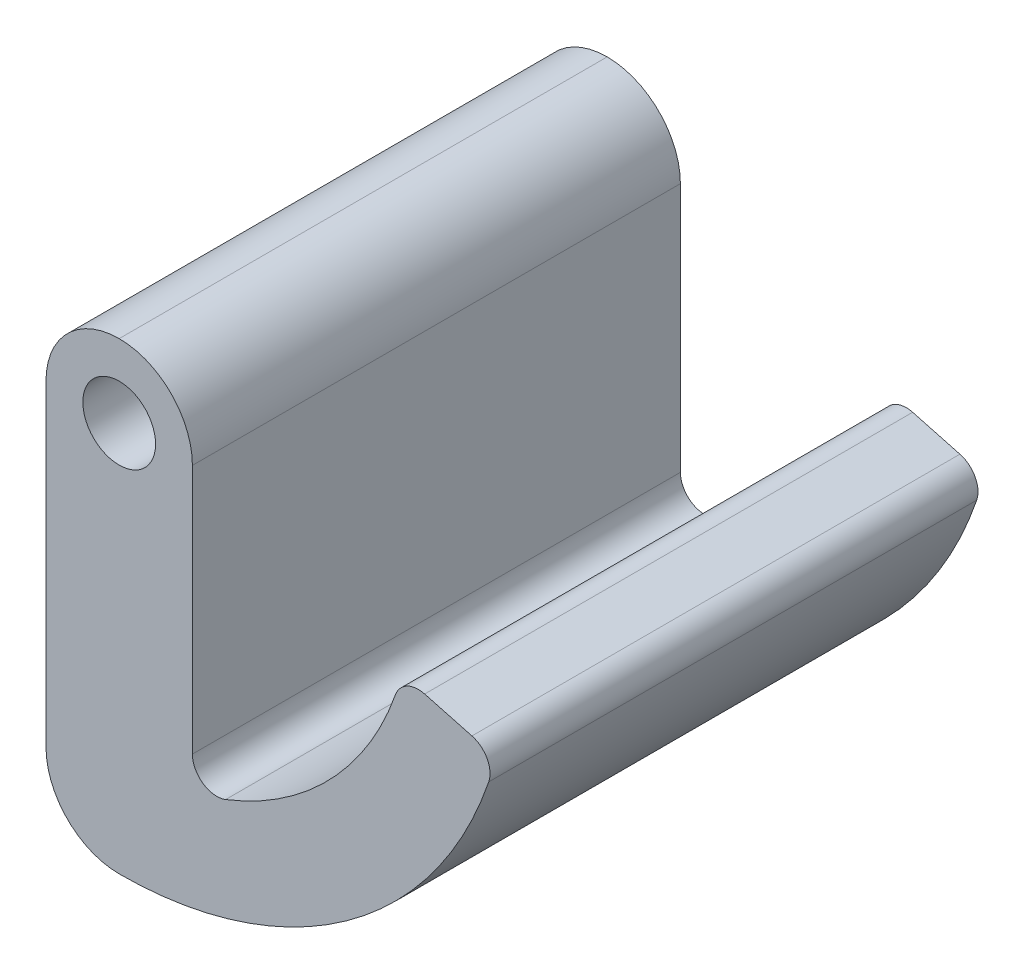
ISO-10303-21;
HEADER;
FILE_DESCRIPTION(('STEP AP214'),'2;1');
FILE_NAME('part.step','',(''),(''),'','','');
FILE_SCHEMA(('AUTOMOTIVE_DESIGN { 1 0 10303 214 1 1 1 1 }'));
ENDSEC;
DATA;
#1=APPLICATION_CONTEXT('core data for automotive mechanical design processes');
#2=APPLICATION_PROTOCOL_DEFINITION('international standard','automotive_design',2000,#1);
#3=PRODUCT_CONTEXT('',#1,'mechanical');
#4=PRODUCT('Part','Part','',(#3));
#5=PRODUCT_RELATED_PRODUCT_CATEGORY('part','',(#4));
#6=PRODUCT_DEFINITION_FORMATION('','',#4);
#7=PRODUCT_DEFINITION_CONTEXT('part definition',#1,'design');
#8=PRODUCT_DEFINITION('design','',#6,#7);
#9=PRODUCT_DEFINITION_SHAPE('','',#8);
#10=(LENGTH_UNIT() NAMED_UNIT(*) SI_UNIT(.MILLI.,.METRE.));
#11=(NAMED_UNIT(*) PLANE_ANGLE_UNIT() SI_UNIT($,.RADIAN.));
#12=(NAMED_UNIT(*) SI_UNIT($,.STERADIAN.) SOLID_ANGLE_UNIT());
#13=UNCERTAINTY_MEASURE_WITH_UNIT(LENGTH_MEASURE(1.E-05),#10,'distance_accuracy_value','');
#14=(GEOMETRIC_REPRESENTATION_CONTEXT(3) GLOBAL_UNCERTAINTY_ASSIGNED_CONTEXT((#13)) GLOBAL_UNIT_ASSIGNED_CONTEXT((#10,
#11,#12)) REPRESENTATION_CONTEXT('',''));
#15=CARTESIAN_POINT('',(0.,0.,0.));
#16=DIRECTION('',(0.,0.,1.));
#17=DIRECTION('',(1.,0.,0.));
#18=AXIS2_PLACEMENT_3D('',#15,#16,#17);
#19=CARTESIAN_POINT('',(0.,0.,20.));
#20=DIRECTION('',(0.,0.,1.));
#21=DIRECTION('',(1.,0.,0.));
#22=AXIS2_PLACEMENT_3D('',#19,#20,#21);
#23=PLANE('',#22);
#24=CARTESIAN_POINT('',(0.,0.,20.));
#25=DIRECTION('',(0.,0.,1.));
#26=DIRECTION('',(1.,0.,0.));
#27=AXIS2_PLACEMENT_3D('',#24,#25,#26);
#28=CIRCLE('',#27,32.);
#29=CARTESIAN_POINT('',(0.,-32.,20.));
#30=VERTEX_POINT('',#29);
#31=CARTESIAN_POINT('',(30.2887145961351,-10.3244258006861,20.));
#32=VERTEX_POINT('',#31);
#33=EDGE_CURVE('E123',#30,#32,#28,.T.);
#34=ORIENTED_EDGE('',*,*,#33,.T.);
#35=CARTESIAN_POINT('',(28.3956699338766,-9.67914918814325,20.));
#36=DIRECTION('',(0.,0.,1.));
#37=DIRECTION('',(1.,0.,0.));
#38=AXIS2_PLACEMENT_3D('',#35,#36,#37);
#39=CIRCLE('',#38,2.);
#40=CARTESIAN_POINT('',(28.9133080240817,-7.74729753556512,20.));
#41=VERTEX_POINT('',#40);
#42=EDGE_CURVE('E186',#32,#41,#39,.T.);
#43=ORIENTED_EDGE('',*,*,#42,.T.);
#44=DIRECTION('',(-0.965925826289067,0.258819045102524,0.));
#45=VECTOR('',#44,1.);
#46=CARTESIAN_POINT('',(23.1822198309376,-6.21165708246059,20.));
#47=LINE('',#46,#45);
#48=CARTESIAN_POINT('',(25.0396592562992,-6.70935647647597,20.));
#49=VERTEX_POINT('',#48);
#50=EDGE_CURVE('E136',#41,#49,#47,.T.);
#51=ORIENTED_EDGE('',*,*,#50,.T.);
#52=CARTESIAN_POINT('',(24.5220211660942,-8.6412081290541,20.));
#53=DIRECTION('',(0.,0.,1.));
#54=DIRECTION('',(1.,0.,0.));
#55=AXIS2_PLACEMENT_3D('',#52,#53,#54);
#56=CIRCLE('',#55,2.);
#57=CARTESIAN_POINT('',(22.6357118456254,-7.97649981143455,20.));
#58=VERTEX_POINT('',#57);
#59=EDGE_CURVE('E184',#49,#58,#56,.T.);
#60=ORIENTED_EDGE('',*,*,#59,.T.);
#61=CARTESIAN_POINT('',(0.,0.,20.));
#62=DIRECTION('',(0.,0.,-1.));
#63=DIRECTION('',(1.,0.,0.));
#64=AXIS2_PLACEMENT_3D('',#61,#62,#63);
#65=CIRCLE('',#64,24.);
#66=CARTESIAN_POINT('',(8.72727272727273,-22.3569834893664,20.));
#67=VERTEX_POINT('',#66);
#68=EDGE_CURVE('E144',#58,#67,#65,.T.);
#69=ORIENTED_EDGE('',*,*,#68,.T.);
#70=CARTESIAN_POINT('',(8.,-20.4939015319192,20.));
#71=DIRECTION('',(0.,0.,1.));
#72=DIRECTION('',(1.,0.,0.));
#73=AXIS2_PLACEMENT_3D('',#70,#71,#72);
#74=CIRCLE('',#73,2.);
#75=CARTESIAN_POINT('',(6.,-20.4939015319192,20.));
#76=VERTEX_POINT('',#75);
#77=EDGE_CURVE('E11',#67,#76,#74,.F.);
#78=ORIENTED_EDGE('',*,*,#77,.T.);
#79=DIRECTION('',(0.,1.,0.));
#80=VECTOR('',#79,1.);
#81=CARTESIAN_POINT('',(6.,6.,20.));
#82=LINE('',#81,#80);
#83=CARTESIAN_POINT('',(6.,0.,20.));
#84=VERTEX_POINT('',#83);
#85=EDGE_CURVE('E140',#76,#84,#82,.T.);
#86=ORIENTED_EDGE('',*,*,#85,.T.);
#87=CARTESIAN_POINT('',(0.,0.,20.));
#88=DIRECTION('',(0.,0.,1.));
#89=DIRECTION('',(1.,0.,0.));
#90=AXIS2_PLACEMENT_3D('',#87,#88,#89);
#91=CIRCLE('',#90,6.);
#92=CARTESIAN_POINT('',(0.,6.,20.));
#93=VERTEX_POINT('',#92);
#94=EDGE_CURVE('E157',#84,#93,#91,.T.);
#95=ORIENTED_EDGE('',*,*,#94,.T.);
#96=CARTESIAN_POINT('',(0.,0.,20.));
#97=DIRECTION('',(0.,0.,1.));
#98=DIRECTION('',(1.,0.,0.));
#99=AXIS2_PLACEMENT_3D('',#96,#97,#98);
#100=CIRCLE('',#99,6.);
#101=CARTESIAN_POINT('',(-6.,0.,20.));
#102=VERTEX_POINT('',#101);
#103=EDGE_CURVE('E130',#93,#102,#100,.T.);
#104=ORIENTED_EDGE('',*,*,#103,.T.);
#105=DIRECTION('',(0.,-1.,0.));
#106=VECTOR('',#105,1.);
#107=CARTESIAN_POINT('',(-6.,6.,20.));
#108=LINE('',#107,#106);
#109=CARTESIAN_POINT('',(-6.,-26.,20.));
#110=VERTEX_POINT('',#109);
#111=EDGE_CURVE('E126',#102,#110,#108,.T.);
#112=ORIENTED_EDGE('',*,*,#111,.T.);
#113=CARTESIAN_POINT('',(0.,-26.,20.));
#114=DIRECTION('',(0.,0.,1.));
#115=DIRECTION('',(1.,0.,0.));
#116=AXIS2_PLACEMENT_3D('',#113,#114,#115);
#117=CIRCLE('',#116,6.);
#118=EDGE_CURVE('E121',#110,#30,#117,.T.);
#119=ORIENTED_EDGE('',*,*,#118,.T.);
#120=EDGE_LOOP('',(#34,#43,#51,#60,#69,#78,#86,#95,#104,#112,#119));
#121=FACE_BOUND('',#120,.T.);
#122=CARTESIAN_POINT('',(0.,0.,20.));
#123=DIRECTION('',(0.,0.,1.));
#124=DIRECTION('',(1.,0.,0.));
#125=AXIS2_PLACEMENT_3D('',#122,#123,#124);
#126=CIRCLE('',#125,2.98);
#127=CARTESIAN_POINT('',(2.98,0.,20.));
#128=VERTEX_POINT('',#127);
#129=EDGE_CURVE('E224',#128,#128,#126,.T.);
#130=ORIENTED_EDGE('',*,*,#129,.F.);
#131=EDGE_LOOP('',(#130));
#132=FACE_BOUND('',#131,.T.);
#133=ADVANCED_FACE('F37',(#121,#132),#23,.T.);
#134=CARTESIAN_POINT('',(0.,0.,-20.));
#135=DIRECTION('',(0.,0.,1.));
#136=DIRECTION('',(1.,0.,0.));
#137=AXIS2_PLACEMENT_3D('',#134,#135,#136);
#138=PLANE('',#137);
#139=DIRECTION('',(-0.965925826289067,0.258819045102524,0.));
#140=VECTOR('',#139,1.);
#141=CARTESIAN_POINT('',(23.1822198309376,-6.21165708246059,-20.));
#142=LINE('',#141,#140);
#143=CARTESIAN_POINT('',(28.9133080240817,-7.74729753556512,-20.));
#144=VERTEX_POINT('',#143);
#145=CARTESIAN_POINT('',(25.0396592562992,-6.70935647647597,-20.));
#146=VERTEX_POINT('',#145);
#147=EDGE_CURVE('E201',#144,#146,#142,.T.);
#148=ORIENTED_EDGE('',*,*,#147,.F.);
#149=CARTESIAN_POINT('',(28.3956699338766,-9.67914918814325,-20.));
#150=DIRECTION('',(0.,0.,1.));
#151=DIRECTION('',(1.,0.,0.));
#152=AXIS2_PLACEMENT_3D('',#149,#150,#151);
#153=CIRCLE('',#152,2.);
#154=CARTESIAN_POINT('',(30.2887145961351,-10.3244258006861,-20.));
#155=VERTEX_POINT('',#154);
#156=EDGE_CURVE('E60',#144,#155,#153,.F.);
#157=ORIENTED_EDGE('',*,*,#156,.T.);
#158=CARTESIAN_POINT('',(0.,0.,-20.));
#159=DIRECTION('',(0.,0.,1.));
#160=DIRECTION('',(1.,0.,0.));
#161=AXIS2_PLACEMENT_3D('',#158,#159,#160);
#162=CIRCLE('',#161,32.);
#163=CARTESIAN_POINT('',(0.,-32.,-20.));
#164=VERTEX_POINT('',#163);
#165=EDGE_CURVE('E223',#164,#155,#162,.T.);
#166=ORIENTED_EDGE('',*,*,#165,.F.);
#167=CARTESIAN_POINT('',(0.,-26.,-20.));
#168=DIRECTION('',(0.,0.,1.));
#169=DIRECTION('',(1.,0.,0.));
#170=AXIS2_PLACEMENT_3D('',#167,#168,#169);
#171=CIRCLE('',#170,6.);
#172=CARTESIAN_POINT('',(-6.,-26.,-20.));
#173=VERTEX_POINT('',#172);
#174=EDGE_CURVE('E139',#164,#173,#171,.F.);
#175=ORIENTED_EDGE('',*,*,#174,.T.);
#176=DIRECTION('',(0.,-1.,0.));
#177=VECTOR('',#176,1.);
#178=CARTESIAN_POINT('',(-6.,6.,-20.));
#179=LINE('',#178,#177);
#180=CARTESIAN_POINT('',(-6.,0.,-20.));
#181=VERTEX_POINT('',#180);
#182=EDGE_CURVE('E222',#181,#173,#179,.T.);
#183=ORIENTED_EDGE('',*,*,#182,.F.);
#184=CARTESIAN_POINT('',(0.,0.,-20.));
#185=DIRECTION('',(0.,0.,1.));
#186=DIRECTION('',(1.,0.,0.));
#187=AXIS2_PLACEMENT_3D('',#184,#185,#186);
#188=CIRCLE('',#187,6.);
#189=CARTESIAN_POINT('',(0.,6.,-20.));
#190=VERTEX_POINT('',#189);
#191=EDGE_CURVE('E142',#181,#190,#188,.F.);
#192=ORIENTED_EDGE('',*,*,#191,.T.);
#193=CARTESIAN_POINT('',(0.,0.,-20.));
#194=DIRECTION('',(0.,0.,1.));
#195=DIRECTION('',(1.,0.,0.));
#196=AXIS2_PLACEMENT_3D('',#193,#194,#195);
#197=CIRCLE('',#196,6.);
#198=CARTESIAN_POINT('',(6.,0.,-20.));
#199=VERTEX_POINT('',#198);
#200=EDGE_CURVE('E151',#190,#199,#197,.F.);
#201=ORIENTED_EDGE('',*,*,#200,.T.);
#202=DIRECTION('',(0.,1.,0.));
#203=VECTOR('',#202,1.);
#204=CARTESIAN_POINT('',(6.,6.,-20.));
#205=LINE('',#204,#203);
#206=CARTESIAN_POINT('',(6.,-20.4939015319192,-20.));
#207=VERTEX_POINT('',#206);
#208=EDGE_CURVE('E147',#207,#199,#205,.T.);
#209=ORIENTED_EDGE('',*,*,#208,.F.);
#210=CARTESIAN_POINT('',(8.,-20.4939015319192,-20.));
#211=DIRECTION('',(0.,0.,1.));
#212=DIRECTION('',(1.,0.,0.));
#213=AXIS2_PLACEMENT_3D('',#210,#211,#212);
#214=CIRCLE('',#213,2.);
#215=CARTESIAN_POINT('',(8.72727272727273,-22.3569834893664,-20.));
#216=VERTEX_POINT('',#215);
#217=EDGE_CURVE('E45',#207,#216,#214,.T.);
#218=ORIENTED_EDGE('',*,*,#217,.T.);
#219=CARTESIAN_POINT('',(0.,0.,-20.));
#220=DIRECTION('',(0.,0.,-1.));
#221=DIRECTION('',(1.,0.,0.));
#222=AXIS2_PLACEMENT_3D('',#219,#220,#221);
#223=CIRCLE('',#222,24.);
#224=CARTESIAN_POINT('',(22.6357118456254,-7.97649981143455,-20.));
#225=VERTEX_POINT('',#224);
#226=EDGE_CURVE('E192',#225,#216,#223,.T.);
#227=ORIENTED_EDGE('',*,*,#226,.F.);
#228=CARTESIAN_POINT('',(24.5220211660942,-8.6412081290541,-20.));
#229=DIRECTION('',(0.,0.,1.));
#230=DIRECTION('',(1.,0.,0.));
#231=AXIS2_PLACEMENT_3D('',#228,#229,#230);
#232=CIRCLE('',#231,2.);
#233=EDGE_CURVE('E180',#225,#146,#232,.F.);
#234=ORIENTED_EDGE('',*,*,#233,.T.);
#235=EDGE_LOOP('',(#148,#157,#166,#175,#183,#192,#201,#209,#218,#227,#234));
#236=FACE_BOUND('',#235,.T.);
#237=CARTESIAN_POINT('',(0.,0.,-20.));
#238=DIRECTION('',(0.,0.,1.));
#239=DIRECTION('',(1.,0.,0.));
#240=AXIS2_PLACEMENT_3D('',#237,#238,#239);
#241=CIRCLE('',#240,2.98);
#242=CARTESIAN_POINT('',(2.98,0.,-20.));
#243=VERTEX_POINT('',#242);
#244=EDGE_CURVE('E167',#243,#243,#241,.T.);
#245=ORIENTED_EDGE('',*,*,#244,.T.);
#246=EDGE_LOOP('',(#245));
#247=FACE_BOUND('',#246,.T.);
#248=ADVANCED_FACE('F190',(#236,#247),#138,.F.);
#249=CARTESIAN_POINT('',(-6.,6.,20.));
#250=DIRECTION('',(1.,0.,0.));
#251=DIRECTION('',(0.,1.,0.));
#252=AXIS2_PLACEMENT_3D('',#249,#250,#251);
#253=PLANE('',#252);
#254=ORIENTED_EDGE('',*,*,#111,.F.);
#255=DIRECTION('',(0.,0.,-1.));
#256=VECTOR('',#255,1.);
#257=CARTESIAN_POINT('',(-6.,0.,20.));
#258=LINE('',#257,#256);
#259=EDGE_CURVE('E161',#102,#181,#258,.T.);
#260=ORIENTED_EDGE('',*,*,#259,.T.);
#261=ORIENTED_EDGE('',*,*,#182,.T.);
#262=DIRECTION('',(0.,0.,-1.));
#263=VECTOR('',#262,1.);
#264=CARTESIAN_POINT('',(-6.,-26.,20.));
#265=LINE('',#264,#263);
#266=EDGE_CURVE('E159',#173,#110,#265,.F.);
#267=ORIENTED_EDGE('',*,*,#266,.T.);
#268=EDGE_LOOP('',(#254,#260,#261,#267));
#269=FACE_BOUND('',#268,.T.);
#270=ADVANCED_FACE('F221',(#269),#253,.F.);
#271=CARTESIAN_POINT('',(0.,0.,20.));
#272=DIRECTION('',(0.,0.,-1.));
#273=DIRECTION('',(-1.,0.,0.));
#274=AXIS2_PLACEMENT_3D('',#271,#272,#273);
#275=CYLINDRICAL_SURFACE('',#274,32.);
#276=ORIENTED_EDGE('',*,*,#165,.T.);
#277=DIRECTION('',(0.,0.,-1.));
#278=VECTOR('',#277,1.);
#279=CARTESIAN_POINT('',(30.2887145961351,-10.3244258006861,20.));
#280=LINE('',#279,#278);
#281=EDGE_CURVE('E52',#155,#32,#280,.F.);
#282=ORIENTED_EDGE('',*,*,#281,.T.);
#283=ORIENTED_EDGE('',*,*,#33,.F.);
#284=DIRECTION('',(0.,0.,-1.));
#285=VECTOR('',#284,1.);
#286=CARTESIAN_POINT('',(0.,-32.,20.));
#287=LINE('',#286,#285);
#288=EDGE_CURVE('E135',#30,#164,#287,.T.);
#289=ORIENTED_EDGE('',*,*,#288,.T.);
#290=EDGE_LOOP('',(#276,#282,#283,#289));
#291=FACE_BOUND('',#290,.T.);
#292=ADVANCED_FACE('F134',(#291),#275,.T.);
#293=CARTESIAN_POINT('',(23.1822198309376,-6.21165708246059,20.));
#294=DIRECTION('',(-0.258819045102524,-0.965925826289067,0.));
#295=DIRECTION('',(0.965925826289067,-0.258819045102524,0.));
#296=AXIS2_PLACEMENT_3D('',#293,#294,#295);
#297=PLANE('',#296);
#298=ORIENTED_EDGE('',*,*,#50,.F.);
#299=DIRECTION('',(0.,0.,-1.));
#300=VECTOR('',#299,1.);
#301=CARTESIAN_POINT('',(28.9133080240817,-7.74729753556512,20.));
#302=LINE('',#301,#300);
#303=EDGE_CURVE('E177',#41,#144,#302,.T.);
#304=ORIENTED_EDGE('',*,*,#303,.T.);
#305=ORIENTED_EDGE('',*,*,#147,.T.);
#306=DIRECTION('',(0.,0.,-1.));
#307=VECTOR('',#306,1.);
#308=CARTESIAN_POINT('',(25.0396592562992,-6.70935647647597,20.));
#309=LINE('',#308,#307);
#310=EDGE_CURVE('E175',#146,#49,#309,.F.);
#311=ORIENTED_EDGE('',*,*,#310,.T.);
#312=EDGE_LOOP('',(#298,#304,#305,#311));
#313=FACE_BOUND('',#312,.T.);
#314=ADVANCED_FACE('F235',(#313),#297,.F.);
#315=CARTESIAN_POINT('',(0.,0.,20.));
#316=DIRECTION('',(0.,0.,-1.));
#317=DIRECTION('',(-1.,0.,0.));
#318=AXIS2_PLACEMENT_3D('',#315,#316,#317);
#319=CYLINDRICAL_SURFACE('',#318,24.);
#320=ORIENTED_EDGE('',*,*,#226,.T.);
#321=DIRECTION('',(0.,0.,-1.));
#322=VECTOR('',#321,1.);
#323=CARTESIAN_POINT('',(8.72727272727273,-22.3569834893664,20.));
#324=LINE('',#323,#322);
#325=EDGE_CURVE('E173',#216,#67,#324,.F.);
#326=ORIENTED_EDGE('',*,*,#325,.T.);
#327=ORIENTED_EDGE('',*,*,#68,.F.);
#328=DIRECTION('',(0.,0.,-1.));
#329=VECTOR('',#328,1.);
#330=CARTESIAN_POINT('',(22.6357118456254,-7.97649981143455,20.));
#331=LINE('',#330,#329);
#332=EDGE_CURVE('E170',#58,#225,#331,.T.);
#333=ORIENTED_EDGE('',*,*,#332,.T.);
#334=EDGE_LOOP('',(#320,#326,#327,#333));
#335=FACE_BOUND('',#334,.T.);
#336=ADVANCED_FACE('F197',(#335),#319,.F.);
#337=CARTESIAN_POINT('',(6.,6.,20.));
#338=DIRECTION('',(-1.,0.,0.));
#339=DIRECTION('',(0.,-1.,0.));
#340=AXIS2_PLACEMENT_3D('',#337,#338,#339);
#341=PLANE('',#340);
#342=ORIENTED_EDGE('',*,*,#85,.F.);
#343=DIRECTION('',(0.,0.,1.));
#344=VECTOR('',#343,1.);
#345=CARTESIAN_POINT('',(6.,-20.4939015319192,-20.));
#346=LINE('',#345,#344);
#347=EDGE_CURVE('E163',#76,#207,#346,.F.);
#348=ORIENTED_EDGE('',*,*,#347,.T.);
#349=ORIENTED_EDGE('',*,*,#208,.T.);
#350=DIRECTION('',(0.,0.,-1.));
#351=VECTOR('',#350,1.);
#352=CARTESIAN_POINT('',(6.,0.,20.));
#353=LINE('',#352,#351);
#354=EDGE_CURVE('E131',#199,#84,#353,.F.);
#355=ORIENTED_EDGE('',*,*,#354,.T.);
#356=EDGE_LOOP('',(#342,#348,#349,#355));
#357=FACE_BOUND('',#356,.T.);
#358=ADVANCED_FACE('F207',(#357),#341,.F.);
#359=CARTESIAN_POINT('',(0.,0.,20.));
#360=DIRECTION('',(0.,0.,-1.));
#361=DIRECTION('',(-1.,0.,0.));
#362=AXIS2_PLACEMENT_3D('',#359,#360,#361);
#363=CYLINDRICAL_SURFACE('',#362,2.98);
#364=ORIENTED_EDGE('',*,*,#129,.T.);
#365=EDGE_LOOP('',(#364));
#366=FACE_BOUND('',#365,.T.);
#367=ORIENTED_EDGE('',*,*,#244,.F.);
#368=EDGE_LOOP('',(#367));
#369=FACE_BOUND('',#368,.T.);
#370=ADVANCED_FACE('F246',(#366,#369),#363,.F.);
#371=CARTESIAN_POINT('',(0.,0.,20.));
#372=DIRECTION('',(0.,0.,-1.));
#373=DIRECTION('',(-1.,0.,0.));
#374=AXIS2_PLACEMENT_3D('',#371,#372,#373);
#375=CYLINDRICAL_SURFACE('',#374,6.);
#376=ORIENTED_EDGE('',*,*,#259,.F.);
#377=ORIENTED_EDGE('',*,*,#103,.F.);
#378=DIRECTION('',(0.,0.,-1.));
#379=VECTOR('',#378,1.);
#380=CARTESIAN_POINT('',(0.,6.,20.));
#381=LINE('',#380,#379);
#382=EDGE_CURVE('E164',#190,#93,#381,.F.);
#383=ORIENTED_EDGE('',*,*,#382,.F.);
#384=ORIENTED_EDGE('',*,*,#191,.F.);
#385=EDGE_LOOP('',(#376,#377,#383,#384));
#386=FACE_BOUND('',#385,.T.);
#387=ADVANCED_FACE('F216',(#386),#375,.T.);
#388=CARTESIAN_POINT('',(0.,0.,20.));
#389=DIRECTION('',(0.,0.,-1.));
#390=DIRECTION('',(-1.,0.,0.));
#391=AXIS2_PLACEMENT_3D('',#388,#389,#390);
#392=CYLINDRICAL_SURFACE('',#391,6.);
#393=ORIENTED_EDGE('',*,*,#94,.F.);
#394=ORIENTED_EDGE('',*,*,#354,.F.);
#395=ORIENTED_EDGE('',*,*,#200,.F.);
#396=ORIENTED_EDGE('',*,*,#382,.T.);
#397=EDGE_LOOP('',(#393,#394,#395,#396));
#398=FACE_BOUND('',#397,.T.);
#399=ADVANCED_FACE('F211',(#398),#392,.T.);
#400=CARTESIAN_POINT('',(0.,-26.,20.));
#401=DIRECTION('',(0.,0.,-1.));
#402=DIRECTION('',(-1.,0.,0.));
#403=AXIS2_PLACEMENT_3D('',#400,#401,#402);
#404=CYLINDRICAL_SURFACE('',#403,6.);
#405=ORIENTED_EDGE('',*,*,#118,.F.);
#406=ORIENTED_EDGE('',*,*,#266,.F.);
#407=ORIENTED_EDGE('',*,*,#174,.F.);
#408=ORIENTED_EDGE('',*,*,#288,.F.);
#409=EDGE_LOOP('',(#405,#406,#407,#408));
#410=FACE_BOUND('',#409,.T.);
#411=ADVANCED_FACE('F138',(#410),#404,.T.);
#412=CARTESIAN_POINT('',(8.,-20.4939015319192,20.));
#413=DIRECTION('',(0.,0.,-1.));
#414=DIRECTION('',(-1.,0.,0.));
#415=AXIS2_PLACEMENT_3D('',#412,#413,#414);
#416=CYLINDRICAL_SURFACE('',#415,2.);
#417=ORIENTED_EDGE('',*,*,#77,.F.);
#418=ORIENTED_EDGE('',*,*,#325,.F.);
#419=ORIENTED_EDGE('',*,*,#217,.F.);
#420=ORIENTED_EDGE('',*,*,#347,.F.);
#421=EDGE_LOOP('',(#417,#418,#419,#420));
#422=FACE_BOUND('',#421,.T.);
#423=ADVANCED_FACE('F203',(#422),#416,.F.);
#424=CARTESIAN_POINT('',(28.3956699338766,-9.67914918814325,20.));
#425=DIRECTION('',(0.,0.,-1.));
#426=DIRECTION('',(-1.,0.,0.));
#427=AXIS2_PLACEMENT_3D('',#424,#425,#426);
#428=CYLINDRICAL_SURFACE('',#427,2.);
#429=ORIENTED_EDGE('',*,*,#42,.F.);
#430=ORIENTED_EDGE('',*,*,#281,.F.);
#431=ORIENTED_EDGE('',*,*,#156,.F.);
#432=ORIENTED_EDGE('',*,*,#303,.F.);
#433=EDGE_LOOP('',(#429,#430,#431,#432));
#434=FACE_BOUND('',#433,.T.);
#435=ADVANCED_FACE('F276',(#434),#428,.T.);
#436=CARTESIAN_POINT('',(24.5220211660942,-8.6412081290541,20.));
#437=DIRECTION('',(0.,0.,-1.));
#438=DIRECTION('',(-1.,0.,0.));
#439=AXIS2_PLACEMENT_3D('',#436,#437,#438);
#440=CYLINDRICAL_SURFACE('',#439,2.);
#441=ORIENTED_EDGE('',*,*,#59,.F.);
#442=ORIENTED_EDGE('',*,*,#310,.F.);
#443=ORIENTED_EDGE('',*,*,#233,.F.);
#444=ORIENTED_EDGE('',*,*,#332,.F.);
#445=EDGE_LOOP('',(#441,#442,#443,#444));
#446=FACE_BOUND('',#445,.T.);
#447=ADVANCED_FACE('F39',(#446),#440,.T.);
#448=CLOSED_SHELL('',(#133,#248,#270,#292,#314,#336,#358,#370,#387,#399,#411,#423,#435,#447));
#449=MANIFOLD_SOLID_BREP('B2',#448);
#450=ADVANCED_BREP_SHAPE_REPRESENTATION('',(#18,#449),#14);
#451=SHAPE_DEFINITION_REPRESENTATION(#9,#450);
ENDSEC;
END-ISO-10303-21;
